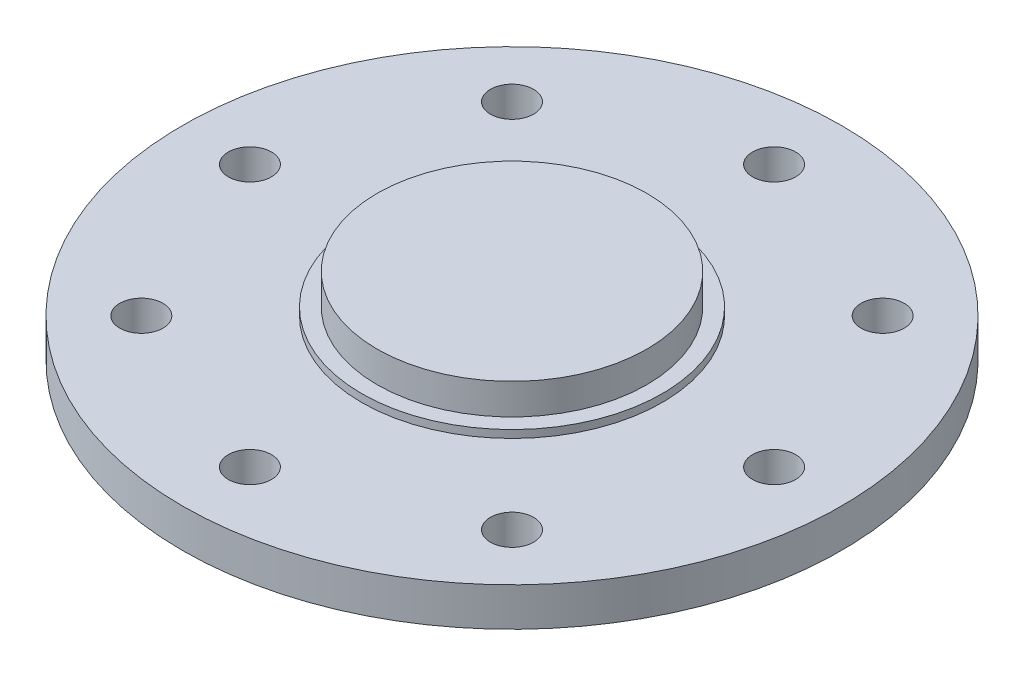
ISO-10303-21;
HEADER;
FILE_DESCRIPTION(('STEP AP214'),'2;1');
FILE_NAME('part.step','',(''),(''),'','','');
FILE_SCHEMA(('AUTOMOTIVE_DESIGN { 1 0 10303 214 1 1 1 1 }'));
ENDSEC;
DATA;
#1=APPLICATION_CONTEXT('core data for automotive mechanical design processes');
#2=APPLICATION_PROTOCOL_DEFINITION('international standard','automotive_design',2000,#1);
#3=PRODUCT_CONTEXT('',#1,'mechanical');
#4=PRODUCT('Part','Part','',(#3));
#5=PRODUCT_RELATED_PRODUCT_CATEGORY('part','',(#4));
#6=PRODUCT_DEFINITION_FORMATION('','',#4);
#7=PRODUCT_DEFINITION_CONTEXT('part definition',#1,'design');
#8=PRODUCT_DEFINITION('design','',#6,#7);
#9=PRODUCT_DEFINITION_SHAPE('','',#8);
#10=(LENGTH_UNIT() NAMED_UNIT(*) SI_UNIT(.MILLI.,.METRE.));
#11=(NAMED_UNIT(*) PLANE_ANGLE_UNIT() SI_UNIT($,.RADIAN.));
#12=(NAMED_UNIT(*) SI_UNIT($,.STERADIAN.) SOLID_ANGLE_UNIT());
#13=UNCERTAINTY_MEASURE_WITH_UNIT(LENGTH_MEASURE(1.E-05),#10,'distance_accuracy_value','');
#14=(GEOMETRIC_REPRESENTATION_CONTEXT(3) GLOBAL_UNCERTAINTY_ASSIGNED_CONTEXT((#13)) GLOBAL_UNIT_ASSIGNED_CONTEXT((#10,
#11,#12)) REPRESENTATION_CONTEXT('',''));
#15=CARTESIAN_POINT('',(0.,0.,0.));
#16=DIRECTION('',(0.,0.,1.));
#17=DIRECTION('',(1.,0.,0.));
#18=AXIS2_PLACEMENT_3D('',#15,#16,#17);
#19=CARTESIAN_POINT('',(0.,5.,0.));
#20=DIRECTION('',(0.,-1.,0.));
#21=DIRECTION('',(0.,0.,-1.));
#22=AXIS2_PLACEMENT_3D('',#19,#20,#21);
#23=CYLINDRICAL_SURFACE('',#22,42.75);
#24=CARTESIAN_POINT('',(0.,5.,0.));
#25=DIRECTION('',(0.,1.,0.));
#26=DIRECTION('',(0.,0.,1.));
#27=AXIS2_PLACEMENT_3D('',#24,#25,#26);
#28=CIRCLE('',#27,42.75);
#29=CARTESIAN_POINT('',(0.,5.,42.75));
#30=VERTEX_POINT('',#29);
#31=EDGE_CURVE('E10',#30,#30,#28,.T.);
#32=ORIENTED_EDGE('',*,*,#31,.F.);
#33=EDGE_LOOP('',(#32));
#34=FACE_BOUND('',#33,.T.);
#35=CARTESIAN_POINT('',(0.,0.,0.));
#36=DIRECTION('',(0.,1.,0.));
#37=DIRECTION('',(0.,0.,1.));
#38=AXIS2_PLACEMENT_3D('',#35,#36,#37);
#39=CIRCLE('',#38,42.75);
#40=CARTESIAN_POINT('',(0.,0.,42.75));
#41=VERTEX_POINT('',#40);
#42=EDGE_CURVE('E51',#41,#41,#39,.T.);
#43=ORIENTED_EDGE('',*,*,#42,.T.);
#44=EDGE_LOOP('',(#43));
#45=FACE_BOUND('',#44,.T.);
#46=ADVANCED_FACE('F43',(#34,#45),#23,.T.);
#47=CARTESIAN_POINT('',(0.,5.,0.));
#48=DIRECTION('',(0.,1.,0.));
#49=DIRECTION('',(0.,0.,1.));
#50=AXIS2_PLACEMENT_3D('',#47,#48,#49);
#51=PLANE('',#50);
#52=CARTESIAN_POINT('',(0.,5.,0.));
#53=DIRECTION('',(0.,1.,0.));
#54=DIRECTION('',(0.,0.,1.));
#55=AXIS2_PLACEMENT_3D('',#52,#53,#54);
#56=CIRCLE('',#55,19.5);
#57=CARTESIAN_POINT('',(0.,5.,19.5));
#58=VERTEX_POINT('',#57);
#59=EDGE_CURVE('E126',#58,#58,#56,.T.);
#60=ORIENTED_EDGE('',*,*,#59,.F.);
#61=EDGE_LOOP('',(#60));
#62=FACE_BOUND('',#61,.T.);
#63=CARTESIAN_POINT('',(0.,5.,-34.));
#64=DIRECTION('',(0.,1.,0.));
#65=DIRECTION('',(0.,0.,1.));
#66=AXIS2_PLACEMENT_3D('',#63,#64,#65);
#67=CIRCLE('',#66,2.8);
#68=CARTESIAN_POINT('',(0.,5.,-31.2));
#69=VERTEX_POINT('',#68);
#70=EDGE_CURVE('E116',#69,#69,#67,.T.);
#71=ORIENTED_EDGE('',*,*,#70,.F.);
#72=EDGE_LOOP('',(#71));
#73=FACE_BOUND('',#72,.T.);
#74=CARTESIAN_POINT('',(24.041630560343,5.,-24.0416305603422));
#75=DIRECTION('',(0.,1.,0.));
#76=DIRECTION('',(0.,0.,1.));
#77=AXIS2_PLACEMENT_3D('',#74,#75,#76);
#78=CIRCLE('',#77,2.8);
#79=CARTESIAN_POINT('',(24.041630560343,5.,-21.2416305603422));
#80=VERTEX_POINT('',#79);
#81=EDGE_CURVE('E112',#80,#80,#78,.T.);
#82=ORIENTED_EDGE('',*,*,#81,.F.);
#83=EDGE_LOOP('',(#82));
#84=FACE_BOUND('',#83,.T.);
#85=CARTESIAN_POINT('',(34.,5.,5.92553321043305E-13));
#86=DIRECTION('',(0.,1.,0.));
#87=DIRECTION('',(0.,0.,1.));
#88=AXIS2_PLACEMENT_3D('',#85,#86,#87);
#89=CIRCLE('',#88,2.8);
#90=CARTESIAN_POINT('',(34.,5.,2.80000000000059));
#91=VERTEX_POINT('',#90);
#92=EDGE_CURVE('E104',#91,#91,#89,.T.);
#93=ORIENTED_EDGE('',*,*,#92,.F.);
#94=EDGE_LOOP('',(#93));
#95=FACE_BOUND('',#94,.T.);
#96=CARTESIAN_POINT('',(24.0416305603425,5.,24.0416305603427));
#97=DIRECTION('',(0.,1.,0.));
#98=DIRECTION('',(0.,0.,1.));
#99=AXIS2_PLACEMENT_3D('',#96,#97,#98);
#100=CIRCLE('',#99,2.8);
#101=CARTESIAN_POINT('',(24.0416305603425,5.,26.8416305603428));
#102=VERTEX_POINT('',#101);
#103=EDGE_CURVE('E96',#102,#102,#100,.T.);
#104=ORIENTED_EDGE('',*,*,#103,.F.);
#105=EDGE_LOOP('',(#104));
#106=FACE_BOUND('',#105,.T.);
#107=CARTESIAN_POINT('',(-2.34035013590983E-13,5.,34.));
#108=DIRECTION('',(0.,1.,0.));
#109=DIRECTION('',(0.,0.,1.));
#110=AXIS2_PLACEMENT_3D('',#107,#108,#109);
#111=CIRCLE('',#110,2.8);
#112=CARTESIAN_POINT('',(-2.34035013590983E-13,5.,36.8));
#113=VERTEX_POINT('',#112);
#114=EDGE_CURVE('E88',#113,#113,#111,.T.);
#115=ORIENTED_EDGE('',*,*,#114,.F.);
#116=EDGE_LOOP('',(#115));
#117=FACE_BOUND('',#116,.T.);
#118=CARTESIAN_POINT('',(-24.0416305603428,5.,24.0416305603424));
#119=DIRECTION('',(0.,1.,0.));
#120=DIRECTION('',(0.,0.,1.));
#121=AXIS2_PLACEMENT_3D('',#118,#119,#120);
#122=CIRCLE('',#121,2.8);
#123=CARTESIAN_POINT('',(-24.0416305603428,5.,26.8416305603424));
#124=VERTEX_POINT('',#123);
#125=EDGE_CURVE('E80',#124,#124,#122,.T.);
#126=ORIENTED_EDGE('',*,*,#125,.F.);
#127=EDGE_LOOP('',(#126));
#128=FACE_BOUND('',#127,.T.);
#129=CARTESIAN_POINT('',(-34.,5.,-3.51052520386475E-13));
#130=DIRECTION('',(0.,1.,0.));
#131=DIRECTION('',(0.,0.,1.));
#132=AXIS2_PLACEMENT_3D('',#129,#130,#131);
#133=CIRCLE('',#132,2.8);
#134=CARTESIAN_POINT('',(-34.,5.,2.79999999999965));
#135=VERTEX_POINT('',#134);
#136=EDGE_CURVE('E72',#135,#135,#133,.T.);
#137=ORIENTED_EDGE('',*,*,#136,.F.);
#138=EDGE_LOOP('',(#137));
#139=FACE_BOUND('',#138,.T.);
#140=CARTESIAN_POINT('',(-24.0416305603423,5.,-24.0416305603429));
#141=DIRECTION('',(0.,1.,0.));
#142=DIRECTION('',(0.,0.,1.));
#143=AXIS2_PLACEMENT_3D('',#140,#141,#142);
#144=CIRCLE('',#143,2.8);
#145=CARTESIAN_POINT('',(-24.0416305603423,5.,-21.2416305603429));
#146=VERTEX_POINT('',#145);
#147=EDGE_CURVE('E63',#146,#146,#144,.T.);
#148=ORIENTED_EDGE('',*,*,#147,.F.);
#149=EDGE_LOOP('',(#148));
#150=FACE_BOUND('',#149,.T.);
#151=ORIENTED_EDGE('',*,*,#31,.T.);
#152=EDGE_LOOP('',(#151));
#153=FACE_BOUND('',#152,.T.);
#154=ADVANCED_FACE('F158',(#62,#73,#84,#95,#106,#117,#128,#139,#150,#153),#51,.T.);
#155=CARTESIAN_POINT('',(0.,0.,0.));
#156=DIRECTION('',(0.,1.,0.));
#157=DIRECTION('',(0.,0.,1.));
#158=AXIS2_PLACEMENT_3D('',#155,#156,#157);
#159=PLANE('',#158);
#160=CARTESIAN_POINT('',(0.,0.,-34.));
#161=DIRECTION('',(0.,1.,0.));
#162=DIRECTION('',(0.,0.,1.));
#163=AXIS2_PLACEMENT_3D('',#160,#161,#162);
#164=CIRCLE('',#163,2.8);
#165=CARTESIAN_POINT('',(0.,0.,-31.2));
#166=VERTEX_POINT('',#165);
#167=EDGE_CURVE('E57',#166,#166,#164,.T.);
#168=ORIENTED_EDGE('',*,*,#167,.T.);
#169=EDGE_LOOP('',(#168));
#170=FACE_BOUND('',#169,.T.);
#171=CARTESIAN_POINT('',(24.041630560343,0.,-24.0416305603422));
#172=DIRECTION('',(0.,1.,0.));
#173=DIRECTION('',(0.,0.,1.));
#174=AXIS2_PLACEMENT_3D('',#171,#172,#173);
#175=CIRCLE('',#174,2.8);
#176=CARTESIAN_POINT('',(24.041630560343,0.,-21.2416305603422));
#177=VERTEX_POINT('',#176);
#178=EDGE_CURVE('E108',#177,#177,#175,.T.);
#179=ORIENTED_EDGE('',*,*,#178,.T.);
#180=EDGE_LOOP('',(#179));
#181=FACE_BOUND('',#180,.T.);
#182=CARTESIAN_POINT('',(34.,0.,5.92553321043305E-13));
#183=DIRECTION('',(0.,1.,0.));
#184=DIRECTION('',(0.,0.,1.));
#185=AXIS2_PLACEMENT_3D('',#182,#183,#184);
#186=CIRCLE('',#185,2.8);
#187=CARTESIAN_POINT('',(34.,0.,2.80000000000059));
#188=VERTEX_POINT('',#187);
#189=EDGE_CURVE('E100',#188,#188,#186,.T.);
#190=ORIENTED_EDGE('',*,*,#189,.T.);
#191=EDGE_LOOP('',(#190));
#192=FACE_BOUND('',#191,.T.);
#193=CARTESIAN_POINT('',(24.0416305603425,0.,24.0416305603427));
#194=DIRECTION('',(0.,1.,0.));
#195=DIRECTION('',(0.,0.,1.));
#196=AXIS2_PLACEMENT_3D('',#193,#194,#195);
#197=CIRCLE('',#196,2.8);
#198=CARTESIAN_POINT('',(24.0416305603425,0.,26.8416305603428));
#199=VERTEX_POINT('',#198);
#200=EDGE_CURVE('E92',#199,#199,#197,.T.);
#201=ORIENTED_EDGE('',*,*,#200,.T.);
#202=EDGE_LOOP('',(#201));
#203=FACE_BOUND('',#202,.T.);
#204=CARTESIAN_POINT('',(-2.34035013590983E-13,0.,34.));
#205=DIRECTION('',(0.,1.,0.));
#206=DIRECTION('',(0.,0.,1.));
#207=AXIS2_PLACEMENT_3D('',#204,#205,#206);
#208=CIRCLE('',#207,2.8);
#209=CARTESIAN_POINT('',(-2.34035013590983E-13,0.,36.8));
#210=VERTEX_POINT('',#209);
#211=EDGE_CURVE('E84',#210,#210,#208,.T.);
#212=ORIENTED_EDGE('',*,*,#211,.T.);
#213=EDGE_LOOP('',(#212));
#214=FACE_BOUND('',#213,.T.);
#215=CARTESIAN_POINT('',(-24.0416305603428,0.,24.0416305603424));
#216=DIRECTION('',(0.,1.,0.));
#217=DIRECTION('',(0.,0.,1.));
#218=AXIS2_PLACEMENT_3D('',#215,#216,#217);
#219=CIRCLE('',#218,2.8);
#220=CARTESIAN_POINT('',(-24.0416305603428,0.,26.8416305603424));
#221=VERTEX_POINT('',#220);
#222=EDGE_CURVE('E76',#221,#221,#219,.T.);
#223=ORIENTED_EDGE('',*,*,#222,.T.);
#224=EDGE_LOOP('',(#223));
#225=FACE_BOUND('',#224,.T.);
#226=CARTESIAN_POINT('',(-34.,0.,-3.51052520386475E-13));
#227=DIRECTION('',(0.,1.,0.));
#228=DIRECTION('',(0.,0.,1.));
#229=AXIS2_PLACEMENT_3D('',#226,#227,#228);
#230=CIRCLE('',#229,2.8);
#231=CARTESIAN_POINT('',(-34.,0.,2.79999999999965));
#232=VERTEX_POINT('',#231);
#233=EDGE_CURVE('E68',#232,#232,#230,.T.);
#234=ORIENTED_EDGE('',*,*,#233,.T.);
#235=EDGE_LOOP('',(#234));
#236=FACE_BOUND('',#235,.T.);
#237=CARTESIAN_POINT('',(-24.0416305603423,0.,-24.0416305603429));
#238=DIRECTION('',(0.,1.,0.));
#239=DIRECTION('',(0.,0.,1.));
#240=AXIS2_PLACEMENT_3D('',#237,#238,#239);
#241=CIRCLE('',#240,2.8);
#242=CARTESIAN_POINT('',(-24.0416305603423,0.,-21.2416305603429));
#243=VERTEX_POINT('',#242);
#244=EDGE_CURVE('E59',#243,#243,#241,.T.);
#245=ORIENTED_EDGE('',*,*,#244,.T.);
#246=EDGE_LOOP('',(#245));
#247=FACE_BOUND('',#246,.T.);
#248=ORIENTED_EDGE('',*,*,#42,.F.);
#249=EDGE_LOOP('',(#248));
#250=FACE_BOUND('',#249,.T.);
#251=ADVANCED_FACE('F164',(#170,#181,#192,#203,#214,#225,#236,#247,#250),#159,.F.);
#252=CARTESIAN_POINT('',(-24.0416305603423,0.,-24.0416305603429));
#253=DIRECTION('',(0.,1.,0.));
#254=DIRECTION('',(0.,0.,1.));
#255=AXIS2_PLACEMENT_3D('',#252,#253,#254);
#256=CYLINDRICAL_SURFACE('',#255,2.8);
#257=ORIENTED_EDGE('',*,*,#244,.F.);
#258=EDGE_LOOP('',(#257));
#259=FACE_BOUND('',#258,.T.);
#260=ORIENTED_EDGE('',*,*,#147,.T.);
#261=EDGE_LOOP('',(#260));
#262=FACE_BOUND('',#261,.T.);
#263=ADVANCED_FACE('F170',(#259,#262),#256,.F.);
#264=CARTESIAN_POINT('',(-34.,0.,-3.51052520386475E-13));
#265=DIRECTION('',(0.,1.,0.));
#266=DIRECTION('',(0.,0.,1.));
#267=AXIS2_PLACEMENT_3D('',#264,#265,#266);
#268=CYLINDRICAL_SURFACE('',#267,2.8);
#269=ORIENTED_EDGE('',*,*,#233,.F.);
#270=EDGE_LOOP('',(#269));
#271=FACE_BOUND('',#270,.T.);
#272=ORIENTED_EDGE('',*,*,#136,.T.);
#273=EDGE_LOOP('',(#272));
#274=FACE_BOUND('',#273,.T.);
#275=ADVANCED_FACE('F175',(#271,#274),#268,.F.);
#276=CARTESIAN_POINT('',(-24.0416305603428,0.,24.0416305603424));
#277=DIRECTION('',(0.,1.,0.));
#278=DIRECTION('',(0.,0.,1.));
#279=AXIS2_PLACEMENT_3D('',#276,#277,#278);
#280=CYLINDRICAL_SURFACE('',#279,2.8);
#281=ORIENTED_EDGE('',*,*,#222,.F.);
#282=EDGE_LOOP('',(#281));
#283=FACE_BOUND('',#282,.T.);
#284=ORIENTED_EDGE('',*,*,#125,.T.);
#285=EDGE_LOOP('',(#284));
#286=FACE_BOUND('',#285,.T.);
#287=ADVANCED_FACE('F182',(#283,#286),#280,.F.);
#288=CARTESIAN_POINT('',(-2.34035013590983E-13,0.,34.));
#289=DIRECTION('',(0.,1.,0.));
#290=DIRECTION('',(0.,0.,1.));
#291=AXIS2_PLACEMENT_3D('',#288,#289,#290);
#292=CYLINDRICAL_SURFACE('',#291,2.8);
#293=ORIENTED_EDGE('',*,*,#211,.F.);
#294=EDGE_LOOP('',(#293));
#295=FACE_BOUND('',#294,.T.);
#296=ORIENTED_EDGE('',*,*,#114,.T.);
#297=EDGE_LOOP('',(#296));
#298=FACE_BOUND('',#297,.T.);
#299=ADVANCED_FACE('F186',(#295,#298),#292,.F.);
#300=CARTESIAN_POINT('',(24.0416305603425,0.,24.0416305603427));
#301=DIRECTION('',(0.,1.,0.));
#302=DIRECTION('',(0.,0.,1.));
#303=AXIS2_PLACEMENT_3D('',#300,#301,#302);
#304=CYLINDRICAL_SURFACE('',#303,2.8);
#305=ORIENTED_EDGE('',*,*,#200,.F.);
#306=EDGE_LOOP('',(#305));
#307=FACE_BOUND('',#306,.T.);
#308=ORIENTED_EDGE('',*,*,#103,.T.);
#309=EDGE_LOOP('',(#308));
#310=FACE_BOUND('',#309,.T.);
#311=ADVANCED_FACE('F190',(#307,#310),#304,.F.);
#312=CARTESIAN_POINT('',(34.,0.,5.92553321043305E-13));
#313=DIRECTION('',(0.,1.,0.));
#314=DIRECTION('',(0.,0.,1.));
#315=AXIS2_PLACEMENT_3D('',#312,#313,#314);
#316=CYLINDRICAL_SURFACE('',#315,2.8);
#317=ORIENTED_EDGE('',*,*,#189,.F.);
#318=EDGE_LOOP('',(#317));
#319=FACE_BOUND('',#318,.T.);
#320=ORIENTED_EDGE('',*,*,#92,.T.);
#321=EDGE_LOOP('',(#320));
#322=FACE_BOUND('',#321,.T.);
#323=ADVANCED_FACE('F194',(#319,#322),#316,.F.);
#324=CARTESIAN_POINT('',(24.041630560343,0.,-24.0416305603422));
#325=DIRECTION('',(0.,1.,0.));
#326=DIRECTION('',(0.,0.,1.));
#327=AXIS2_PLACEMENT_3D('',#324,#325,#326);
#328=CYLINDRICAL_SURFACE('',#327,2.8);
#329=ORIENTED_EDGE('',*,*,#178,.F.);
#330=EDGE_LOOP('',(#329));
#331=FACE_BOUND('',#330,.T.);
#332=ORIENTED_EDGE('',*,*,#81,.T.);
#333=EDGE_LOOP('',(#332));
#334=FACE_BOUND('',#333,.T.);
#335=ADVANCED_FACE('F198',(#331,#334),#328,.F.);
#336=CARTESIAN_POINT('',(0.,0.,-34.));
#337=DIRECTION('',(0.,1.,0.));
#338=DIRECTION('',(0.,0.,1.));
#339=AXIS2_PLACEMENT_3D('',#336,#337,#338);
#340=CYLINDRICAL_SURFACE('',#339,2.8);
#341=ORIENTED_EDGE('',*,*,#167,.F.);
#342=EDGE_LOOP('',(#341));
#343=FACE_BOUND('',#342,.T.);
#344=ORIENTED_EDGE('',*,*,#70,.T.);
#345=EDGE_LOOP('',(#344));
#346=FACE_BOUND('',#345,.T.);
#347=ADVANCED_FACE('F154',(#343,#346),#340,.F.);
#348=CARTESIAN_POINT('',(0.,6.,0.));
#349=DIRECTION('',(0.,-1.,0.));
#350=DIRECTION('',(0.,0.,-1.));
#351=AXIS2_PLACEMENT_3D('',#348,#349,#350);
#352=CYLINDRICAL_SURFACE('',#351,19.5);
#353=CARTESIAN_POINT('',(0.,6.,0.));
#354=DIRECTION('',(0.,1.,0.));
#355=DIRECTION('',(0.,0.,1.));
#356=AXIS2_PLACEMENT_3D('',#353,#354,#355);
#357=CIRCLE('',#356,19.5);
#358=CARTESIAN_POINT('',(0.,6.,19.5));
#359=VERTEX_POINT('',#358);
#360=EDGE_CURVE('E130',#359,#359,#357,.T.);
#361=ORIENTED_EDGE('',*,*,#360,.F.);
#362=EDGE_LOOP('',(#361));
#363=FACE_BOUND('',#362,.T.);
#364=ORIENTED_EDGE('',*,*,#59,.T.);
#365=EDGE_LOOP('',(#364));
#366=FACE_BOUND('',#365,.T.);
#367=ADVANCED_FACE('F145',(#363,#366),#352,.T.);
#368=CARTESIAN_POINT('',(0.,6.,0.));
#369=DIRECTION('',(0.,1.,0.));
#370=DIRECTION('',(0.,0.,1.));
#371=AXIS2_PLACEMENT_3D('',#368,#369,#370);
#372=PLANE('',#371);
#373=CARTESIAN_POINT('',(0.,6.,0.));
#374=DIRECTION('',(0.,1.,0.));
#375=DIRECTION('',(0.,0.,1.));
#376=AXIS2_PLACEMENT_3D('',#373,#374,#375);
#377=CIRCLE('',#376,17.5);
#378=CARTESIAN_POINT('',(0.,6.,17.5));
#379=VERTEX_POINT('',#378);
#380=EDGE_CURVE('E46',#379,#379,#377,.T.);
#381=ORIENTED_EDGE('',*,*,#380,.F.);
#382=EDGE_LOOP('',(#381));
#383=FACE_BOUND('',#382,.T.);
#384=ORIENTED_EDGE('',*,*,#360,.T.);
#385=EDGE_LOOP('',(#384));
#386=FACE_BOUND('',#385,.T.);
#387=ADVANCED_FACE('F142',(#383,#386),#372,.T.);
#388=CARTESIAN_POINT('',(0.,10.,0.));
#389=DIRECTION('',(0.,1.,0.));
#390=DIRECTION('',(0.,0.,1.));
#391=AXIS2_PLACEMENT_3D('',#388,#389,#390);
#392=PLANE('',#391);
#393=CARTESIAN_POINT('',(0.,10.,0.));
#394=DIRECTION('',(0.,1.,0.));
#395=DIRECTION('',(0.,0.,1.));
#396=AXIS2_PLACEMENT_3D('',#393,#394,#395);
#397=CIRCLE('',#396,17.5);
#398=CARTESIAN_POINT('',(0.,10.,17.5));
#399=VERTEX_POINT('',#398);
#400=EDGE_CURVE('E64',#399,#399,#397,.T.);
#401=ORIENTED_EDGE('',*,*,#400,.T.);
#402=EDGE_LOOP('',(#401));
#403=FACE_BOUND('',#402,.T.);
#404=ADVANCED_FACE('F144',(#403),#392,.T.);
#405=CARTESIAN_POINT('',(0.,10.,0.));
#406=DIRECTION('',(0.,-1.,0.));
#407=DIRECTION('',(0.,0.,-1.));
#408=AXIS2_PLACEMENT_3D('',#405,#406,#407);
#409=CYLINDRICAL_SURFACE('',#408,17.5);
#410=ORIENTED_EDGE('',*,*,#380,.T.);
#411=EDGE_LOOP('',(#410));
#412=FACE_BOUND('',#411,.T.);
#413=ORIENTED_EDGE('',*,*,#400,.F.);
#414=EDGE_LOOP('',(#413));
#415=FACE_BOUND('',#414,.T.);
#416=ADVANCED_FACE('F139',(#412,#415),#409,.T.);
#417=CLOSED_SHELL('',(#46,#154,#251,#263,#275,#287,#299,#311,#323,#335,#347,#367,#387,#404,#416));
#418=MANIFOLD_SOLID_BREP('B2',#417);
#419=ADVANCED_BREP_SHAPE_REPRESENTATION('',(#18,#418),#14);
#420=SHAPE_DEFINITION_REPRESENTATION(#9,#419);
ENDSEC;
END-ISO-10303-21;
